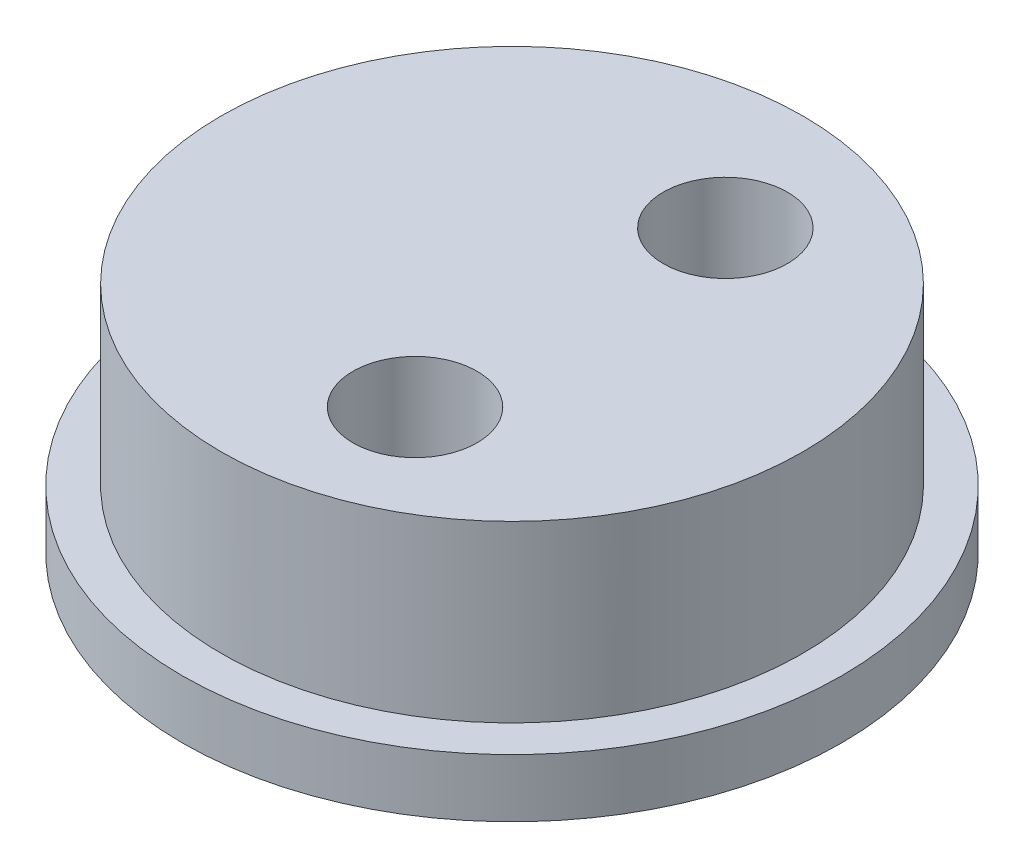
ISO-10303-21;
HEADER;
FILE_DESCRIPTION(('STEP AP214'),'2;1');
FILE_NAME('part.step','',(''),(''),'','','');
FILE_SCHEMA(('AUTOMOTIVE_DESIGN { 1 0 10303 214 1 1 1 1 }'));
ENDSEC;
DATA;
#1=APPLICATION_CONTEXT('core data for automotive mechanical design processes');
#2=APPLICATION_PROTOCOL_DEFINITION('international standard','automotive_design',2000,#1);
#3=PRODUCT_CONTEXT('',#1,'mechanical');
#4=PRODUCT('Part','Part','',(#3));
#5=PRODUCT_RELATED_PRODUCT_CATEGORY('part','',(#4));
#6=PRODUCT_DEFINITION_FORMATION('','',#4);
#7=PRODUCT_DEFINITION_CONTEXT('part definition',#1,'design');
#8=PRODUCT_DEFINITION('design','',#6,#7);
#9=PRODUCT_DEFINITION_SHAPE('','',#8);
#10=(LENGTH_UNIT() NAMED_UNIT(*) SI_UNIT(.MILLI.,.METRE.));
#11=(NAMED_UNIT(*) PLANE_ANGLE_UNIT() SI_UNIT($,.RADIAN.));
#12=(NAMED_UNIT(*) SI_UNIT($,.STERADIAN.) SOLID_ANGLE_UNIT());
#13=UNCERTAINTY_MEASURE_WITH_UNIT(LENGTH_MEASURE(1.E-05),#10,'distance_accuracy_value','');
#14=(GEOMETRIC_REPRESENTATION_CONTEXT(3) GLOBAL_UNCERTAINTY_ASSIGNED_CONTEXT((#13)) GLOBAL_UNIT_ASSIGNED_CONTEXT((#10,
#11,#12)) REPRESENTATION_CONTEXT('',''));
#15=CARTESIAN_POINT('',(0.,0.,0.));
#16=DIRECTION('',(0.,0.,1.));
#17=DIRECTION('',(1.,0.,0.));
#18=AXIS2_PLACEMENT_3D('',#15,#16,#17);
#19=CARTESIAN_POINT('',(-1.5,6.,0.));
#20=DIRECTION('',(0.,-1.,0.));
#21=DIRECTION('',(0.,0.,-1.));
#22=AXIS2_PLACEMENT_3D('',#19,#20,#21);
#23=CYLINDRICAL_SURFACE('',#22,7.5);
#24=CARTESIAN_POINT('',(-1.5,6.,0.));
#25=DIRECTION('',(0.,1.,0.));
#26=DIRECTION('',(0.,0.,1.));
#27=AXIS2_PLACEMENT_3D('',#24,#25,#26);
#28=CIRCLE('',#27,7.5);
#29=CARTESIAN_POINT('',(-1.5,6.,7.5));
#30=VERTEX_POINT('',#29);
#31=EDGE_CURVE('E39',#30,#30,#28,.T.);
#32=ORIENTED_EDGE('',*,*,#31,.F.);
#33=EDGE_LOOP('',(#32));
#34=FACE_BOUND('',#33,.T.);
#35=CARTESIAN_POINT('',(-1.5,1.5,0.));
#36=DIRECTION('',(0.,-1.,0.));
#37=DIRECTION('',(0.,0.,-1.));
#38=AXIS2_PLACEMENT_3D('',#35,#36,#37);
#39=CIRCLE('',#38,7.5);
#40=CARTESIAN_POINT('',(-1.5,1.5,-7.5));
#41=VERTEX_POINT('',#40);
#42=EDGE_CURVE('E10',#41,#41,#39,.T.);
#43=ORIENTED_EDGE('',*,*,#42,.F.);
#44=EDGE_LOOP('',(#43));
#45=FACE_BOUND('',#44,.T.);
#46=ADVANCED_FACE('F33',(#34,#45),#23,.T.);
#47=CARTESIAN_POINT('',(-1.5,6.,0.));
#48=DIRECTION('',(0.,1.,0.));
#49=DIRECTION('',(0.,0.,1.));
#50=AXIS2_PLACEMENT_3D('',#47,#48,#49);
#51=PLANE('',#50);
#52=CARTESIAN_POINT('',(0.,6.,-4.));
#53=DIRECTION('',(0.,1.,0.));
#54=DIRECTION('',(0.,0.,1.));
#55=AXIS2_PLACEMENT_3D('',#52,#53,#54);
#56=CIRCLE('',#55,1.6);
#57=CARTESIAN_POINT('',(0.,6.,-2.4));
#58=VERTEX_POINT('',#57);
#59=EDGE_CURVE('E59',#58,#58,#56,.T.);
#60=ORIENTED_EDGE('',*,*,#59,.F.);
#61=EDGE_LOOP('',(#60));
#62=FACE_BOUND('',#61,.T.);
#63=CARTESIAN_POINT('',(0.,6.,4.));
#64=DIRECTION('',(0.,1.,0.));
#65=DIRECTION('',(0.,0.,1.));
#66=AXIS2_PLACEMENT_3D('',#63,#64,#65);
#67=CIRCLE('',#66,1.6);
#68=CARTESIAN_POINT('',(0.,6.,5.6));
#69=VERTEX_POINT('',#68);
#70=EDGE_CURVE('E53',#69,#69,#67,.T.);
#71=ORIENTED_EDGE('',*,*,#70,.F.);
#72=EDGE_LOOP('',(#71));
#73=FACE_BOUND('',#72,.T.);
#74=ORIENTED_EDGE('',*,*,#31,.T.);
#75=EDGE_LOOP('',(#74));
#76=FACE_BOUND('',#75,.T.);
#77=ADVANCED_FACE('F75',(#62,#73,#76),#51,.T.);
#78=CARTESIAN_POINT('',(-1.5,1.5,0.));
#79=DIRECTION('',(0.,-1.,0.));
#80=DIRECTION('',(0.,0.,-1.));
#81=AXIS2_PLACEMENT_3D('',#78,#79,#80);
#82=CYLINDRICAL_SURFACE('',#81,8.5);
#83=CARTESIAN_POINT('',(-1.5,1.5,0.));
#84=DIRECTION('',(0.,-1.,0.));
#85=DIRECTION('',(0.,0.,-1.));
#86=AXIS2_PLACEMENT_3D('',#83,#84,#85);
#87=CIRCLE('',#86,8.5);
#88=CARTESIAN_POINT('',(-1.5,1.5,-8.5));
#89=VERTEX_POINT('',#88);
#90=EDGE_CURVE('E43',#89,#89,#87,.T.);
#91=ORIENTED_EDGE('',*,*,#90,.T.);
#92=EDGE_LOOP('',(#91));
#93=FACE_BOUND('',#92,.T.);
#94=CARTESIAN_POINT('',(-1.5,0.,0.));
#95=DIRECTION('',(0.,-1.,0.));
#96=DIRECTION('',(0.,0.,-1.));
#97=AXIS2_PLACEMENT_3D('',#94,#95,#96);
#98=CIRCLE('',#97,8.5);
#99=CARTESIAN_POINT('',(-1.5,0.,-8.5));
#100=VERTEX_POINT('',#99);
#101=EDGE_CURVE('E47',#100,#100,#98,.T.);
#102=ORIENTED_EDGE('',*,*,#101,.F.);
#103=EDGE_LOOP('',(#102));
#104=FACE_BOUND('',#103,.T.);
#105=ADVANCED_FACE('F78',(#93,#104),#82,.T.);
#106=CARTESIAN_POINT('',(-1.5,1.5,0.));
#107=DIRECTION('',(0.,-1.,0.));
#108=DIRECTION('',(0.,0.,-1.));
#109=AXIS2_PLACEMENT_3D('',#106,#107,#108);
#110=PLANE('',#109);
#111=ORIENTED_EDGE('',*,*,#42,.T.);
#112=EDGE_LOOP('',(#111));
#113=FACE_BOUND('',#112,.T.);
#114=ORIENTED_EDGE('',*,*,#90,.F.);
#115=EDGE_LOOP('',(#114));
#116=FACE_BOUND('',#115,.T.);
#117=ADVANCED_FACE('F88',(#113,#116),#110,.F.);
#118=CARTESIAN_POINT('',(-1.5,0.,0.));
#119=DIRECTION('',(0.,1.,0.));
#120=DIRECTION('',(0.,0.,1.));
#121=AXIS2_PLACEMENT_3D('',#118,#119,#120);
#122=PLANE('',#121);
#123=CARTESIAN_POINT('',(0.,0.,-4.));
#124=DIRECTION('',(0.,1.,0.));
#125=DIRECTION('',(0.,0.,1.));
#126=AXIS2_PLACEMENT_3D('',#123,#124,#125);
#127=CIRCLE('',#126,1.6);
#128=CARTESIAN_POINT('',(0.,0.,-2.4));
#129=VERTEX_POINT('',#128);
#130=EDGE_CURVE('E51',#129,#129,#127,.T.);
#131=ORIENTED_EDGE('',*,*,#130,.T.);
#132=EDGE_LOOP('',(#131));
#133=FACE_BOUND('',#132,.T.);
#134=CARTESIAN_POINT('',(0.,0.,4.));
#135=DIRECTION('',(0.,1.,0.));
#136=DIRECTION('',(0.,0.,1.));
#137=AXIS2_PLACEMENT_3D('',#134,#135,#136);
#138=CIRCLE('',#137,1.6);
#139=CARTESIAN_POINT('',(0.,0.,5.6));
#140=VERTEX_POINT('',#139);
#141=EDGE_CURVE('E56',#140,#140,#138,.T.);
#142=ORIENTED_EDGE('',*,*,#141,.T.);
#143=EDGE_LOOP('',(#142));
#144=FACE_BOUND('',#143,.T.);
#145=ORIENTED_EDGE('',*,*,#101,.T.);
#146=EDGE_LOOP('',(#145));
#147=FACE_BOUND('',#146,.T.);
#148=ADVANCED_FACE('F65',(#133,#144,#147),#122,.F.);
#149=CARTESIAN_POINT('',(0.,0.,4.));
#150=DIRECTION('',(0.,1.,0.));
#151=DIRECTION('',(0.,0.,1.));
#152=AXIS2_PLACEMENT_3D('',#149,#150,#151);
#153=CYLINDRICAL_SURFACE('',#152,1.6);
#154=ORIENTED_EDGE('',*,*,#141,.F.);
#155=EDGE_LOOP('',(#154));
#156=FACE_BOUND('',#155,.T.);
#157=ORIENTED_EDGE('',*,*,#70,.T.);
#158=EDGE_LOOP('',(#157));
#159=FACE_BOUND('',#158,.T.);
#160=ADVANCED_FACE('F71',(#156,#159),#153,.F.);
#161=CARTESIAN_POINT('',(0.,0.,-4.));
#162=DIRECTION('',(0.,1.,0.));
#163=DIRECTION('',(0.,0.,1.));
#164=AXIS2_PLACEMENT_3D('',#161,#162,#163);
#165=CYLINDRICAL_SURFACE('',#164,1.6);
#166=ORIENTED_EDGE('',*,*,#130,.F.);
#167=EDGE_LOOP('',(#166));
#168=FACE_BOUND('',#167,.T.);
#169=ORIENTED_EDGE('',*,*,#59,.T.);
#170=EDGE_LOOP('',(#169));
#171=FACE_BOUND('',#170,.T.);
#172=ADVANCED_FACE('F68',(#168,#171),#165,.F.);
#173=CLOSED_SHELL('',(#46,#77,#105,#117,#148,#160,#172));
#174=MANIFOLD_SOLID_BREP('B2',#173);
#175=ADVANCED_BREP_SHAPE_REPRESENTATION('',(#18,#174),#14);
#176=SHAPE_DEFINITION_REPRESENTATION(#9,#175);
ENDSEC;
END-ISO-10303-21;
